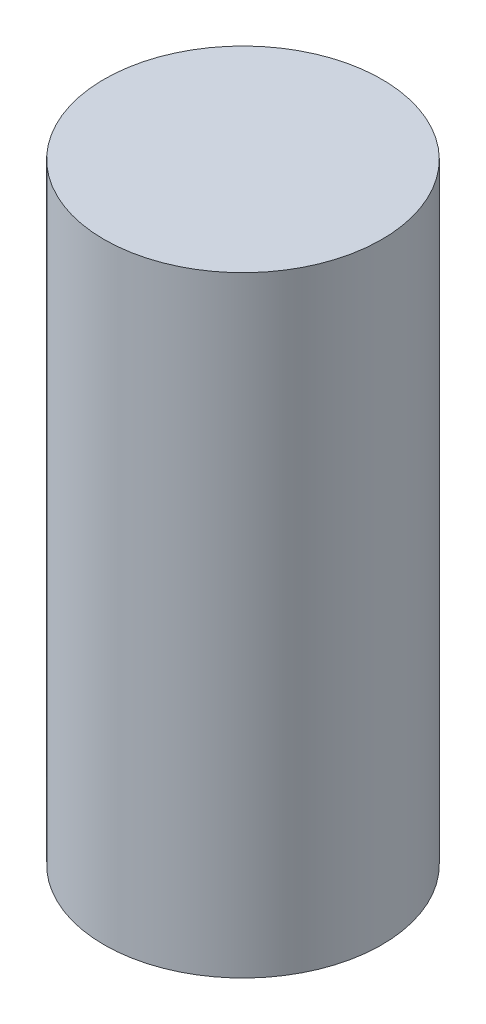
ISO-10303-21;
HEADER;
FILE_DESCRIPTION(('STEP AP214'),'2;1');
FILE_NAME('part.step','',(''),(''),'','','');
FILE_SCHEMA(('AUTOMOTIVE_DESIGN { 1 0 10303 214 1 1 1 1 }'));
ENDSEC;
DATA;
#1=APPLICATION_CONTEXT('core data for automotive mechanical design processes');
#2=APPLICATION_PROTOCOL_DEFINITION('international standard','automotive_design',2000,#1);
#3=PRODUCT_CONTEXT('',#1,'mechanical');
#4=PRODUCT('Part','Part','',(#3));
#5=PRODUCT_RELATED_PRODUCT_CATEGORY('part','',(#4));
#6=PRODUCT_DEFINITION_FORMATION('','',#4);
#7=PRODUCT_DEFINITION_CONTEXT('part definition',#1,'design');
#8=PRODUCT_DEFINITION('design','',#6,#7);
#9=PRODUCT_DEFINITION_SHAPE('','',#8);
#10=(LENGTH_UNIT() NAMED_UNIT(*) SI_UNIT(.MILLI.,.METRE.));
#11=(NAMED_UNIT(*) PLANE_ANGLE_UNIT() SI_UNIT($,.RADIAN.));
#12=(NAMED_UNIT(*) SI_UNIT($,.STERADIAN.) SOLID_ANGLE_UNIT());
#13=UNCERTAINTY_MEASURE_WITH_UNIT(LENGTH_MEASURE(1.E-05),#10,'distance_accuracy_value','');
#14=(GEOMETRIC_REPRESENTATION_CONTEXT(3) GLOBAL_UNCERTAINTY_ASSIGNED_CONTEXT((#13)) GLOBAL_UNIT_ASSIGNED_CONTEXT((#10,
#11,#12)) REPRESENTATION_CONTEXT('',''));
#15=CARTESIAN_POINT('',(0.,0.,0.));
#16=DIRECTION('',(0.,0.,1.));
#17=DIRECTION('',(1.,0.,0.));
#18=AXIS2_PLACEMENT_3D('',#15,#16,#17);
#19=CARTESIAN_POINT('',(0.,44.,0.));
#20=DIRECTION('',(0.,-1.,0.));
#21=DIRECTION('',(0.,0.,-1.));
#22=AXIS2_PLACEMENT_3D('',#19,#20,#21);
#23=CYLINDRICAL_SURFACE('',#22,10.);
#24=CARTESIAN_POINT('',(0.,44.,0.));
#25=DIRECTION('',(0.,1.,0.));
#26=DIRECTION('',(0.,0.,1.));
#27=AXIS2_PLACEMENT_3D('',#24,#25,#26);
#28=CIRCLE('',#27,10.);
#29=CARTESIAN_POINT('',(0.,44.,10.));
#30=VERTEX_POINT('',#29);
#31=EDGE_CURVE('E10',#30,#30,#28,.T.);
#32=ORIENTED_EDGE('',*,*,#31,.F.);
#33=EDGE_LOOP('',(#32));
#34=FACE_BOUND('',#33,.T.);
#35=CARTESIAN_POINT('',(0.,0.,0.));
#36=DIRECTION('',(0.,1.,0.));
#37=DIRECTION('',(0.,0.,1.));
#38=AXIS2_PLACEMENT_3D('',#35,#36,#37);
#39=CIRCLE('',#38,10.);
#40=CARTESIAN_POINT('',(0.,0.,10.));
#41=VERTEX_POINT('',#40);
#42=EDGE_CURVE('E37',#41,#41,#39,.T.);
#43=ORIENTED_EDGE('',*,*,#42,.T.);
#44=EDGE_LOOP('',(#43));
#45=FACE_BOUND('',#44,.T.);
#46=ADVANCED_FACE('F34',(#34,#45),#23,.T.);
#47=CARTESIAN_POINT('',(0.,44.,0.));
#48=DIRECTION('',(0.,1.,0.));
#49=DIRECTION('',(0.,0.,1.));
#50=AXIS2_PLACEMENT_3D('',#47,#48,#49);
#51=PLANE('',#50);
#52=ORIENTED_EDGE('',*,*,#31,.T.);
#53=EDGE_LOOP('',(#52));
#54=FACE_BOUND('',#53,.T.);
#55=ADVANCED_FACE('F49',(#54),#51,.T.);
#56=CARTESIAN_POINT('',(0.,0.,0.));
#57=DIRECTION('',(0.,1.,0.));
#58=DIRECTION('',(0.,0.,1.));
#59=AXIS2_PLACEMENT_3D('',#56,#57,#58);
#60=PLANE('',#59);
#61=ORIENTED_EDGE('',*,*,#42,.F.);
#62=EDGE_LOOP('',(#61));
#63=FACE_BOUND('',#62,.T.);
#64=ADVANCED_FACE('F47',(#63),#60,.F.);
#65=CLOSED_SHELL('',(#46,#55,#64));
#66=MANIFOLD_SOLID_BREP('B2',#65);
#67=ADVANCED_BREP_SHAPE_REPRESENTATION('',(#18,#66),#14);
#68=SHAPE_DEFINITION_REPRESENTATION(#9,#67);
ENDSEC;
END-ISO-10303-21;
